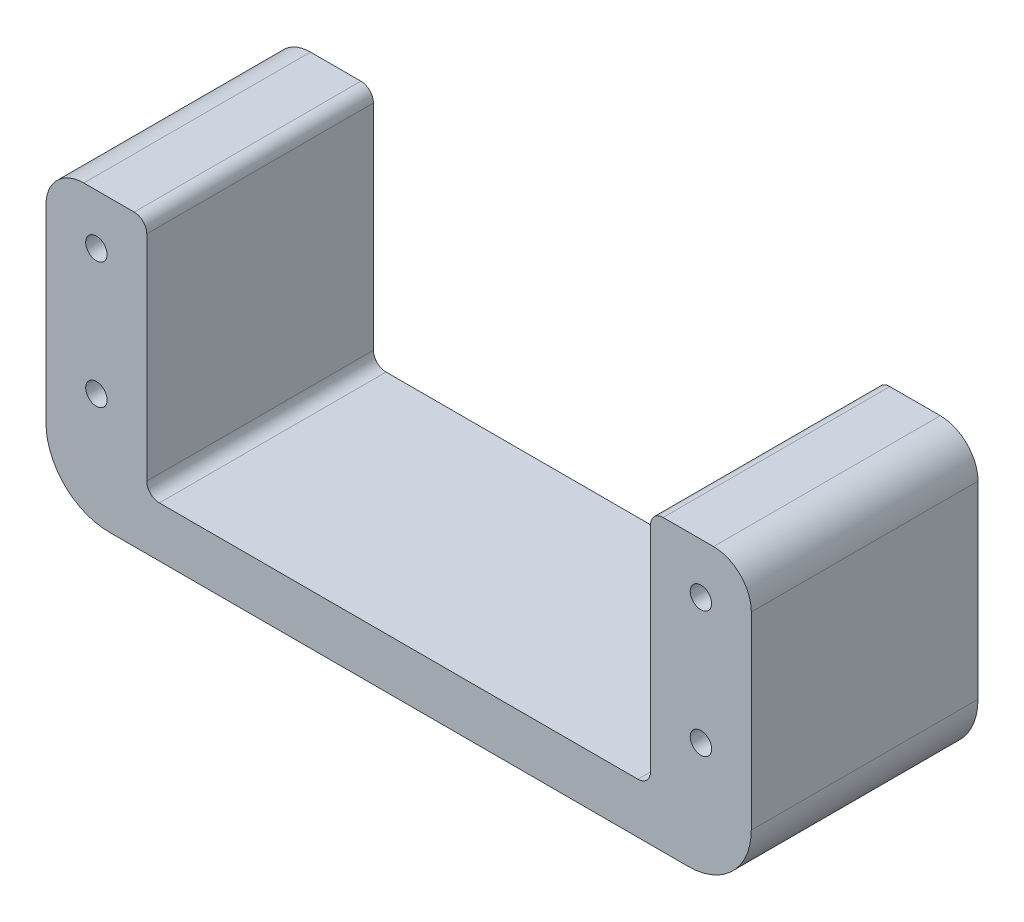
ISO-10303-21;
HEADER;
FILE_DESCRIPTION(('STEP AP214'),'2;1');
FILE_NAME('part.step','',(''),(''),'','','');
FILE_SCHEMA(('AUTOMOTIVE_DESIGN { 1 0 10303 214 1 1 1 1 }'));
ENDSEC;
DATA;
#1=APPLICATION_CONTEXT('core data for automotive mechanical design processes');
#2=APPLICATION_PROTOCOL_DEFINITION('international standard','automotive_design',2000,#1);
#3=PRODUCT_CONTEXT('',#1,'mechanical');
#4=PRODUCT('Part','Part','',(#3));
#5=PRODUCT_RELATED_PRODUCT_CATEGORY('part','',(#4));
#6=PRODUCT_DEFINITION_FORMATION('','',#4);
#7=PRODUCT_DEFINITION_CONTEXT('part definition',#1,'design');
#8=PRODUCT_DEFINITION('design','',#6,#7);
#9=PRODUCT_DEFINITION_SHAPE('','',#8);
#10=(LENGTH_UNIT() NAMED_UNIT(*) SI_UNIT(.MILLI.,.METRE.));
#11=(NAMED_UNIT(*) PLANE_ANGLE_UNIT() SI_UNIT($,.RADIAN.));
#12=(NAMED_UNIT(*) SI_UNIT($,.STERADIAN.) SOLID_ANGLE_UNIT());
#13=UNCERTAINTY_MEASURE_WITH_UNIT(LENGTH_MEASURE(1.E-05),#10,'distance_accuracy_value','');
#14=(GEOMETRIC_REPRESENTATION_CONTEXT(3) GLOBAL_UNCERTAINTY_ASSIGNED_CONTEXT((#13)) GLOBAL_UNIT_ASSIGNED_CONTEXT((#10,
#11,#12)) REPRESENTATION_CONTEXT('',''));
#15=CARTESIAN_POINT('',(0.,0.,0.));
#16=DIRECTION('',(0.,0.,1.));
#17=DIRECTION('',(1.,0.,0.));
#18=AXIS2_PLACEMENT_3D('',#15,#16,#17);
#19=CARTESIAN_POINT('',(0.,0.,18.));
#20=DIRECTION('',(0.,0.,1.));
#21=DIRECTION('',(1.,0.,0.));
#22=AXIS2_PLACEMENT_3D('',#19,#20,#21);
#23=PLANE('',#22);
#24=CARTESIAN_POINT('',(24.,9.,18.));
#25=DIRECTION('',(0.,0.,1.));
#26=DIRECTION('',(-1.,0.,0.));
#27=AXIS2_PLACEMENT_3D('',#24,#25,#26);
#28=CIRCLE('',#27,0.85);
#29=CARTESIAN_POINT('',(23.15,9.,18.));
#30=VERTEX_POINT('',#29);
#31=EDGE_CURVE('E297',#30,#30,#28,.T.);
#32=ORIENTED_EDGE('',*,*,#31,.F.);
#33=EDGE_LOOP('',(#32));
#34=FACE_BOUND('',#33,.T.);
#35=CARTESIAN_POINT('',(-24.,19.,18.));
#36=DIRECTION('',(0.,0.,1.));
#37=DIRECTION('',(1.,0.,0.));
#38=AXIS2_PLACEMENT_3D('',#35,#36,#37);
#39=CIRCLE('',#38,0.85);
#40=CARTESIAN_POINT('',(-23.15,19.,18.));
#41=VERTEX_POINT('',#40);
#42=EDGE_CURVE('E273',#41,#41,#39,.T.);
#43=ORIENTED_EDGE('',*,*,#42,.F.);
#44=EDGE_LOOP('',(#43));
#45=FACE_BOUND('',#44,.T.);
#46=DIRECTION('',(1.,0.,0.));
#47=VECTOR('',#46,1.);
#48=CARTESIAN_POINT('',(-28.,0.,18.));
#49=LINE('',#48,#47);
#50=CARTESIAN_POINT('',(-23.,0.,18.));
#51=VERTEX_POINT('',#50);
#52=CARTESIAN_POINT('',(23.,0.,18.));
#53=VERTEX_POINT('',#52);
#54=EDGE_CURVE('E257',#51,#53,#49,.T.);
#55=ORIENTED_EDGE('',*,*,#54,.T.);
#56=CARTESIAN_POINT('',(23.,5.,18.));
#57=DIRECTION('',(0.,0.,1.));
#58=DIRECTION('',(1.,0.,0.));
#59=AXIS2_PLACEMENT_3D('',#56,#57,#58);
#60=CIRCLE('',#59,5.);
#61=CARTESIAN_POINT('',(28.,5.,18.));
#62=VERTEX_POINT('',#61);
#63=EDGE_CURVE('E41',#53,#62,#60,.T.);
#64=ORIENTED_EDGE('',*,*,#63,.T.);
#65=DIRECTION('',(0.,1.,0.));
#66=VECTOR('',#65,1.);
#67=CARTESIAN_POINT('',(28.,23.,18.));
#68=LINE('',#67,#66);
#69=CARTESIAN_POINT('',(28.,20.,18.));
#70=VERTEX_POINT('',#69);
#71=EDGE_CURVE('E256',#62,#70,#68,.T.);
#72=ORIENTED_EDGE('',*,*,#71,.T.);
#73=CARTESIAN_POINT('',(25.,20.,18.));
#74=DIRECTION('',(0.,0.,1.));
#75=DIRECTION('',(1.,0.,0.));
#76=AXIS2_PLACEMENT_3D('',#73,#74,#75);
#77=CIRCLE('',#76,3.);
#78=CARTESIAN_POINT('',(25.,23.,18.));
#79=VERTEX_POINT('',#78);
#80=EDGE_CURVE('E233',#70,#79,#77,.T.);
#81=ORIENTED_EDGE('',*,*,#80,.T.);
#82=DIRECTION('',(-1.,0.,0.));
#83=VECTOR('',#82,1.);
#84=CARTESIAN_POINT('',(20.,23.,18.));
#85=LINE('',#84,#83);
#86=CARTESIAN_POINT('',(21.,23.,18.));
#87=VERTEX_POINT('',#86);
#88=EDGE_CURVE('E264',#79,#87,#85,.T.);
#89=ORIENTED_EDGE('',*,*,#88,.T.);
#90=CARTESIAN_POINT('',(21.,22.,18.));
#91=DIRECTION('',(0.,0.,1.));
#92=DIRECTION('',(1.,0.,0.));
#93=AXIS2_PLACEMENT_3D('',#90,#91,#92);
#94=CIRCLE('',#93,1.);
#95=CARTESIAN_POINT('',(20.,22.,18.));
#96=VERTEX_POINT('',#95);
#97=EDGE_CURVE('E198',#87,#96,#94,.T.);
#98=ORIENTED_EDGE('',*,*,#97,.T.);
#99=DIRECTION('',(0.,-1.,0.));
#100=VECTOR('',#99,1.);
#101=CARTESIAN_POINT('',(20.,23.,18.));
#102=LINE('',#101,#100);
#103=CARTESIAN_POINT('',(20.,5.,18.));
#104=VERTEX_POINT('',#103);
#105=EDGE_CURVE('E168',#96,#104,#102,.T.);
#106=ORIENTED_EDGE('',*,*,#105,.T.);
#107=CARTESIAN_POINT('',(19.,5.,18.));
#108=DIRECTION('',(0.,0.,1.));
#109=DIRECTION('',(1.,0.,0.));
#110=AXIS2_PLACEMENT_3D('',#107,#108,#109);
#111=CIRCLE('',#110,1.);
#112=CARTESIAN_POINT('',(19.,4.,18.));
#113=VERTEX_POINT('',#112);
#114=EDGE_CURVE('E214',#104,#113,#111,.F.);
#115=ORIENTED_EDGE('',*,*,#114,.T.);
#116=DIRECTION('',(-1.,0.,0.));
#117=VECTOR('',#116,1.);
#118=CARTESIAN_POINT('',(-20.,4.,18.));
#119=LINE('',#118,#117);
#120=CARTESIAN_POINT('',(-19.,4.,18.));
#121=VERTEX_POINT('',#120);
#122=EDGE_CURVE('E281',#113,#121,#119,.T.);
#123=ORIENTED_EDGE('',*,*,#122,.T.);
#124=CARTESIAN_POINT('',(-19.,5.,18.));
#125=DIRECTION('',(0.,0.,1.));
#126=DIRECTION('',(1.,0.,0.));
#127=AXIS2_PLACEMENT_3D('',#124,#125,#126);
#128=CIRCLE('',#127,1.);
#129=CARTESIAN_POINT('',(-20.,5.,18.));
#130=VERTEX_POINT('',#129);
#131=EDGE_CURVE('E218',#121,#130,#128,.F.);
#132=ORIENTED_EDGE('',*,*,#131,.T.);
#133=DIRECTION('',(0.,1.,0.));
#134=VECTOR('',#133,1.);
#135=CARTESIAN_POINT('',(-20.,23.,18.));
#136=LINE('',#135,#134);
#137=CARTESIAN_POINT('',(-20.,22.,18.));
#138=VERTEX_POINT('',#137);
#139=EDGE_CURVE('E278',#130,#138,#136,.T.);
#140=ORIENTED_EDGE('',*,*,#139,.T.);
#141=CARTESIAN_POINT('',(-21.,22.,18.));
#142=DIRECTION('',(0.,0.,1.));
#143=DIRECTION('',(1.,0.,0.));
#144=AXIS2_PLACEMENT_3D('',#141,#142,#143);
#145=CIRCLE('',#144,1.);
#146=CARTESIAN_POINT('',(-21.,23.,18.));
#147=VERTEX_POINT('',#146);
#148=EDGE_CURVE('E196',#138,#147,#145,.T.);
#149=ORIENTED_EDGE('',*,*,#148,.T.);
#150=DIRECTION('',(-1.,0.,0.));
#151=VECTOR('',#150,1.);
#152=CARTESIAN_POINT('',(-28.,23.,18.));
#153=LINE('',#152,#151);
#154=CARTESIAN_POINT('',(-25.,23.,18.));
#155=VERTEX_POINT('',#154);
#156=EDGE_CURVE('E192',#147,#155,#153,.T.);
#157=ORIENTED_EDGE('',*,*,#156,.T.);
#158=CARTESIAN_POINT('',(-25.,20.,18.));
#159=DIRECTION('',(0.,0.,1.));
#160=DIRECTION('',(1.,0.,0.));
#161=AXIS2_PLACEMENT_3D('',#158,#159,#160);
#162=CIRCLE('',#161,3.);
#163=CARTESIAN_POINT('',(-28.,20.,18.));
#164=VERTEX_POINT('',#163);
#165=EDGE_CURVE('E231',#155,#164,#162,.T.);
#166=ORIENTED_EDGE('',*,*,#165,.T.);
#167=DIRECTION('',(0.,-1.,0.));
#168=VECTOR('',#167,1.);
#169=CARTESIAN_POINT('',(-28.,23.,18.));
#170=LINE('',#169,#168);
#171=CARTESIAN_POINT('',(-28.,5.,18.));
#172=VERTEX_POINT('',#171);
#173=EDGE_CURVE('E191',#164,#172,#170,.T.);
#174=ORIENTED_EDGE('',*,*,#173,.T.);
#175=CARTESIAN_POINT('',(-23.,5.,18.));
#176=DIRECTION('',(0.,0.,1.));
#177=DIRECTION('',(1.,0.,0.));
#178=AXIS2_PLACEMENT_3D('',#175,#176,#177);
#179=CIRCLE('',#178,5.);
#180=EDGE_CURVE('E251',#172,#51,#179,.T.);
#181=ORIENTED_EDGE('',*,*,#180,.T.);
#182=EDGE_LOOP('',(#55,#64,#72,#81,#89,#98,#106,#115,#123,#132,#140,#149,#157,#166,#174,#181));
#183=FACE_BOUND('',#182,.T.);
#184=CARTESIAN_POINT('',(-24.,9.,18.));
#185=DIRECTION('',(0.,0.,1.));
#186=DIRECTION('',(1.,0.,0.));
#187=AXIS2_PLACEMENT_3D('',#184,#185,#186);
#188=CIRCLE('',#187,0.85);
#189=CARTESIAN_POINT('',(-23.15,9.,18.));
#190=VERTEX_POINT('',#189);
#191=EDGE_CURVE('E291',#190,#190,#188,.T.);
#192=ORIENTED_EDGE('',*,*,#191,.F.);
#193=EDGE_LOOP('',(#192));
#194=FACE_BOUND('',#193,.T.);
#195=CARTESIAN_POINT('',(24.,19.,18.));
#196=DIRECTION('',(0.,0.,1.));
#197=DIRECTION('',(-1.,0.,0.));
#198=AXIS2_PLACEMENT_3D('',#195,#196,#197);
#199=CIRCLE('',#198,0.85);
#200=CARTESIAN_POINT('',(23.15,19.,18.));
#201=VERTEX_POINT('',#200);
#202=EDGE_CURVE('E303',#201,#201,#199,.T.);
#203=ORIENTED_EDGE('',*,*,#202,.F.);
#204=EDGE_LOOP('',(#203));
#205=FACE_BOUND('',#204,.T.);
#206=ADVANCED_FACE('F33',(#34,#45,#183,#194,#205),#23,.T.);
#207=CARTESIAN_POINT('',(0.,0.,0.));
#208=DIRECTION('',(0.,0.,1.));
#209=DIRECTION('',(1.,0.,0.));
#210=AXIS2_PLACEMENT_3D('',#207,#208,#209);
#211=PLANE('',#210);
#212=DIRECTION('',(0.,1.,0.));
#213=VECTOR('',#212,1.);
#214=CARTESIAN_POINT('',(28.,23.,0.));
#215=LINE('',#214,#213);
#216=CARTESIAN_POINT('',(28.,5.,0.));
#217=VERTEX_POINT('',#216);
#218=CARTESIAN_POINT('',(28.,20.,0.));
#219=VERTEX_POINT('',#218);
#220=EDGE_CURVE('E182',#217,#219,#215,.T.);
#221=ORIENTED_EDGE('',*,*,#220,.F.);
#222=CARTESIAN_POINT('',(23.,5.,0.));
#223=DIRECTION('',(0.,0.,1.));
#224=DIRECTION('',(1.,0.,0.));
#225=AXIS2_PLACEMENT_3D('',#222,#223,#224);
#226=CIRCLE('',#225,5.);
#227=CARTESIAN_POINT('',(23.,0.,0.));
#228=VERTEX_POINT('',#227);
#229=EDGE_CURVE('E245',#217,#228,#226,.F.);
#230=ORIENTED_EDGE('',*,*,#229,.T.);
#231=DIRECTION('',(1.,0.,0.));
#232=VECTOR('',#231,1.);
#233=CARTESIAN_POINT('',(-28.,0.,0.));
#234=LINE('',#233,#232);
#235=CARTESIAN_POINT('',(-23.,0.,0.));
#236=VERTEX_POINT('',#235);
#237=EDGE_CURVE('E268',#236,#228,#234,.T.);
#238=ORIENTED_EDGE('',*,*,#237,.F.);
#239=CARTESIAN_POINT('',(-23.,5.,0.));
#240=DIRECTION('',(0.,0.,1.));
#241=DIRECTION('',(1.,0.,0.));
#242=AXIS2_PLACEMENT_3D('',#239,#240,#241);
#243=CIRCLE('',#242,5.);
#244=CARTESIAN_POINT('',(-28.,5.,0.));
#245=VERTEX_POINT('',#244);
#246=EDGE_CURVE('E243',#236,#245,#243,.F.);
#247=ORIENTED_EDGE('',*,*,#246,.T.);
#248=DIRECTION('',(0.,-1.,0.));
#249=VECTOR('',#248,1.);
#250=CARTESIAN_POINT('',(-28.,23.,0.));
#251=LINE('',#250,#249);
#252=CARTESIAN_POINT('',(-28.,20.,0.));
#253=VERTEX_POINT('',#252);
#254=EDGE_CURVE('E271',#253,#245,#251,.T.);
#255=ORIENTED_EDGE('',*,*,#254,.F.);
#256=CARTESIAN_POINT('',(-25.,20.,0.));
#257=DIRECTION('',(0.,0.,1.));
#258=DIRECTION('',(1.,0.,0.));
#259=AXIS2_PLACEMENT_3D('',#256,#257,#258);
#260=CIRCLE('',#259,3.);
#261=CARTESIAN_POINT('',(-25.,23.,0.));
#262=VERTEX_POINT('',#261);
#263=EDGE_CURVE('E223',#253,#262,#260,.F.);
#264=ORIENTED_EDGE('',*,*,#263,.T.);
#265=DIRECTION('',(-1.,0.,0.));
#266=VECTOR('',#265,1.);
#267=CARTESIAN_POINT('',(-28.,23.,0.));
#268=LINE('',#267,#266);
#269=CARTESIAN_POINT('',(-21.,23.,0.));
#270=VERTEX_POINT('',#269);
#271=EDGE_CURVE('E188',#270,#262,#268,.T.);
#272=ORIENTED_EDGE('',*,*,#271,.F.);
#273=CARTESIAN_POINT('',(-21.,22.,0.));
#274=DIRECTION('',(0.,0.,1.));
#275=DIRECTION('',(1.,0.,0.));
#276=AXIS2_PLACEMENT_3D('',#273,#274,#275);
#277=CIRCLE('',#276,1.);
#278=CARTESIAN_POINT('',(-20.,22.,0.));
#279=VERTEX_POINT('',#278);
#280=EDGE_CURVE('E159',#270,#279,#277,.F.);
#281=ORIENTED_EDGE('',*,*,#280,.T.);
#282=DIRECTION('',(0.,1.,0.));
#283=VECTOR('',#282,1.);
#284=CARTESIAN_POINT('',(-20.,23.,0.));
#285=LINE('',#284,#283);
#286=CARTESIAN_POINT('',(-20.,5.,0.));
#287=VERTEX_POINT('',#286);
#288=EDGE_CURVE('E180',#287,#279,#285,.T.);
#289=ORIENTED_EDGE('',*,*,#288,.F.);
#290=CARTESIAN_POINT('',(-19.,5.,0.));
#291=DIRECTION('',(0.,0.,1.));
#292=DIRECTION('',(1.,0.,0.));
#293=AXIS2_PLACEMENT_3D('',#290,#291,#292);
#294=CIRCLE('',#293,1.);
#295=CARTESIAN_POINT('',(-19.,4.,0.));
#296=VERTEX_POINT('',#295);
#297=EDGE_CURVE('E216',#287,#296,#294,.T.);
#298=ORIENTED_EDGE('',*,*,#297,.T.);
#299=DIRECTION('',(-1.,0.,0.));
#300=VECTOR('',#299,1.);
#301=CARTESIAN_POINT('',(-20.,4.,0.));
#302=LINE('',#301,#300);
#303=CARTESIAN_POINT('',(19.,4.,0.));
#304=VERTEX_POINT('',#303);
#305=EDGE_CURVE('E176',#304,#296,#302,.T.);
#306=ORIENTED_EDGE('',*,*,#305,.F.);
#307=CARTESIAN_POINT('',(19.,5.,0.));
#308=DIRECTION('',(0.,0.,1.));
#309=DIRECTION('',(1.,0.,0.));
#310=AXIS2_PLACEMENT_3D('',#307,#308,#309);
#311=CIRCLE('',#310,1.);
#312=CARTESIAN_POINT('',(20.,5.,0.));
#313=VERTEX_POINT('',#312);
#314=EDGE_CURVE('E175',#304,#313,#311,.T.);
#315=ORIENTED_EDGE('',*,*,#314,.T.);
#316=DIRECTION('',(0.,-1.,0.));
#317=VECTOR('',#316,1.);
#318=CARTESIAN_POINT('',(20.,23.,0.));
#319=LINE('',#318,#317);
#320=CARTESIAN_POINT('',(20.,22.,0.));
#321=VERTEX_POINT('',#320);
#322=EDGE_CURVE('E165',#321,#313,#319,.T.);
#323=ORIENTED_EDGE('',*,*,#322,.F.);
#324=CARTESIAN_POINT('',(21.,22.,0.));
#325=DIRECTION('',(0.,0.,1.));
#326=DIRECTION('',(1.,0.,0.));
#327=AXIS2_PLACEMENT_3D('',#324,#325,#326);
#328=CIRCLE('',#327,1.);
#329=CARTESIAN_POINT('',(21.,23.,0.));
#330=VERTEX_POINT('',#329);
#331=EDGE_CURVE('E149',#321,#330,#328,.F.);
#332=ORIENTED_EDGE('',*,*,#331,.T.);
#333=DIRECTION('',(-1.,0.,0.));
#334=VECTOR('',#333,1.);
#335=CARTESIAN_POINT('',(20.,23.,0.));
#336=LINE('',#335,#334);
#337=CARTESIAN_POINT('',(25.,23.,0.));
#338=VERTEX_POINT('',#337);
#339=EDGE_CURVE('E177',#338,#330,#336,.T.);
#340=ORIENTED_EDGE('',*,*,#339,.F.);
#341=CARTESIAN_POINT('',(25.,20.,0.));
#342=DIRECTION('',(0.,0.,1.));
#343=DIRECTION('',(1.,0.,0.));
#344=AXIS2_PLACEMENT_3D('',#341,#342,#343);
#345=CIRCLE('',#344,3.);
#346=EDGE_CURVE('E225',#338,#219,#345,.F.);
#347=ORIENTED_EDGE('',*,*,#346,.T.);
#348=EDGE_LOOP('',(#221,#230,#238,#247,#255,#264,#272,#281,#289,#298,#306,#315,#323,#332,#340,#347));
#349=FACE_BOUND('',#348,.T.);
#350=CARTESIAN_POINT('',(-24.,19.,0.));
#351=DIRECTION('',(0.,0.,1.));
#352=DIRECTION('',(1.,0.,0.));
#353=AXIS2_PLACEMENT_3D('',#350,#351,#352);
#354=CIRCLE('',#353,0.85);
#355=CARTESIAN_POINT('',(-23.15,19.,0.));
#356=VERTEX_POINT('',#355);
#357=EDGE_CURVE('E288',#356,#356,#354,.T.);
#358=ORIENTED_EDGE('',*,*,#357,.T.);
#359=EDGE_LOOP('',(#358));
#360=FACE_BOUND('',#359,.T.);
#361=CARTESIAN_POINT('',(-24.,9.,0.));
#362=DIRECTION('',(0.,0.,1.));
#363=DIRECTION('',(1.,0.,0.));
#364=AXIS2_PLACEMENT_3D('',#361,#362,#363);
#365=CIRCLE('',#364,0.85);
#366=CARTESIAN_POINT('',(-23.15,9.,0.));
#367=VERTEX_POINT('',#366);
#368=EDGE_CURVE('E294',#367,#367,#365,.T.);
#369=ORIENTED_EDGE('',*,*,#368,.T.);
#370=EDGE_LOOP('',(#369));
#371=FACE_BOUND('',#370,.T.);
#372=CARTESIAN_POINT('',(24.,9.,0.));
#373=DIRECTION('',(0.,0.,1.));
#374=DIRECTION('',(-1.,0.,0.));
#375=AXIS2_PLACEMENT_3D('',#372,#373,#374);
#376=CIRCLE('',#375,0.85);
#377=CARTESIAN_POINT('',(23.15,9.,0.));
#378=VERTEX_POINT('',#377);
#379=EDGE_CURVE('E300',#378,#378,#376,.T.);
#380=ORIENTED_EDGE('',*,*,#379,.T.);
#381=EDGE_LOOP('',(#380));
#382=FACE_BOUND('',#381,.T.);
#383=CARTESIAN_POINT('',(24.,19.,0.));
#384=DIRECTION('',(0.,0.,1.));
#385=DIRECTION('',(-1.,0.,0.));
#386=AXIS2_PLACEMENT_3D('',#383,#384,#385);
#387=CIRCLE('',#386,0.85);
#388=CARTESIAN_POINT('',(23.15,19.,0.));
#389=VERTEX_POINT('',#388);
#390=EDGE_CURVE('E306',#389,#389,#387,.T.);
#391=ORIENTED_EDGE('',*,*,#390,.T.);
#392=EDGE_LOOP('',(#391));
#393=FACE_BOUND('',#392,.T.);
#394=ADVANCED_FACE('F172',(#349,#360,#371,#382,#393),#211,.F.);
#395=CARTESIAN_POINT('',(-28.,23.,18.));
#396=DIRECTION('',(1.,0.,0.));
#397=DIRECTION('',(0.,1.,0.));
#398=AXIS2_PLACEMENT_3D('',#395,#396,#397);
#399=PLANE('',#398);
#400=ORIENTED_EDGE('',*,*,#254,.T.);
#401=DIRECTION('',(0.,0.,-1.));
#402=VECTOR('',#401,1.);
#403=CARTESIAN_POINT('',(-28.,5.,18.));
#404=LINE('',#403,#402);
#405=EDGE_CURVE('E11',#245,#172,#404,.F.);
#406=ORIENTED_EDGE('',*,*,#405,.T.);
#407=ORIENTED_EDGE('',*,*,#173,.F.);
#408=DIRECTION('',(0.,0.,-1.));
#409=VECTOR('',#408,1.);
#410=CARTESIAN_POINT('',(-28.,20.,18.));
#411=LINE('',#410,#409);
#412=EDGE_CURVE('E235',#164,#253,#411,.T.);
#413=ORIENTED_EDGE('',*,*,#412,.T.);
#414=EDGE_LOOP('',(#400,#406,#407,#413));
#415=FACE_BOUND('',#414,.T.);
#416=ADVANCED_FACE('F321',(#415),#399,.F.);
#417=CARTESIAN_POINT('',(-28.,0.,18.));
#418=DIRECTION('',(0.,1.,0.));
#419=DIRECTION('',(0.,0.,1.));
#420=AXIS2_PLACEMENT_3D('',#417,#418,#419);
#421=PLANE('',#420);
#422=ORIENTED_EDGE('',*,*,#237,.T.);
#423=DIRECTION('',(0.,0.,-1.));
#424=VECTOR('',#423,1.);
#425=CARTESIAN_POINT('',(23.,0.,18.));
#426=LINE('',#425,#424);
#427=EDGE_CURVE('E54',#228,#53,#426,.F.);
#428=ORIENTED_EDGE('',*,*,#427,.T.);
#429=ORIENTED_EDGE('',*,*,#54,.F.);
#430=DIRECTION('',(0.,0.,-1.));
#431=VECTOR('',#430,1.);
#432=CARTESIAN_POINT('',(-23.,0.,18.));
#433=LINE('',#432,#431);
#434=EDGE_CURVE('E247',#51,#236,#433,.T.);
#435=ORIENTED_EDGE('',*,*,#434,.T.);
#436=EDGE_LOOP('',(#422,#428,#429,#435));
#437=FACE_BOUND('',#436,.T.);
#438=ADVANCED_FACE('F269',(#437),#421,.F.);
#439=CARTESIAN_POINT('',(28.,23.,18.));
#440=DIRECTION('',(-1.,0.,0.));
#441=DIRECTION('',(0.,-1.,0.));
#442=AXIS2_PLACEMENT_3D('',#439,#440,#441);
#443=PLANE('',#442);
#444=ORIENTED_EDGE('',*,*,#71,.F.);
#445=DIRECTION('',(0.,0.,-1.));
#446=VECTOR('',#445,1.);
#447=CARTESIAN_POINT('',(28.,5.,18.));
#448=LINE('',#447,#446);
#449=EDGE_CURVE('E240',#62,#217,#448,.T.);
#450=ORIENTED_EDGE('',*,*,#449,.T.);
#451=ORIENTED_EDGE('',*,*,#220,.T.);
#452=DIRECTION('',(0.,0.,-1.));
#453=VECTOR('',#452,1.);
#454=CARTESIAN_POINT('',(28.,20.,18.));
#455=LINE('',#454,#453);
#456=EDGE_CURVE('E228',#219,#70,#455,.F.);
#457=ORIENTED_EDGE('',*,*,#456,.T.);
#458=EDGE_LOOP('',(#444,#450,#451,#457));
#459=FACE_BOUND('',#458,.T.);
#460=ADVANCED_FACE('F261',(#459),#443,.F.);
#461=CARTESIAN_POINT('',(20.,23.,18.));
#462=DIRECTION('',(0.,-1.,0.));
#463=DIRECTION('',(0.,0.,-1.));
#464=AXIS2_PLACEMENT_3D('',#461,#462,#463);
#465=PLANE('',#464);
#466=ORIENTED_EDGE('',*,*,#88,.F.);
#467=DIRECTION('',(0.,0.,-1.));
#468=VECTOR('',#467,1.);
#469=CARTESIAN_POINT('',(25.,23.,18.));
#470=LINE('',#469,#468);
#471=EDGE_CURVE('E220',#79,#338,#470,.T.);
#472=ORIENTED_EDGE('',*,*,#471,.T.);
#473=ORIENTED_EDGE('',*,*,#339,.T.);
#474=DIRECTION('',(0.,0.,-1.));
#475=VECTOR('',#474,1.);
#476=CARTESIAN_POINT('',(21.,23.,18.));
#477=LINE('',#476,#475);
#478=EDGE_CURVE('E155',#330,#87,#477,.F.);
#479=ORIENTED_EDGE('',*,*,#478,.T.);
#480=EDGE_LOOP('',(#466,#472,#473,#479));
#481=FACE_BOUND('',#480,.T.);
#482=ADVANCED_FACE('F343',(#481),#465,.F.);
#483=CARTESIAN_POINT('',(20.,23.,18.));
#484=DIRECTION('',(1.,0.,0.));
#485=DIRECTION('',(0.,1.,0.));
#486=AXIS2_PLACEMENT_3D('',#483,#484,#485);
#487=PLANE('',#486);
#488=ORIENTED_EDGE('',*,*,#105,.F.);
#489=DIRECTION('',(0.,0.,-1.));
#490=VECTOR('',#489,1.);
#491=CARTESIAN_POINT('',(20.,22.,18.));
#492=LINE('',#491,#490);
#493=EDGE_CURVE('E153',#96,#321,#492,.T.);
#494=ORIENTED_EDGE('',*,*,#493,.T.);
#495=ORIENTED_EDGE('',*,*,#322,.T.);
#496=DIRECTION('',(0.,0.,-1.));
#497=VECTOR('',#496,1.);
#498=CARTESIAN_POINT('',(20.,5.,18.));
#499=LINE('',#498,#497);
#500=EDGE_CURVE('E169',#313,#104,#499,.F.);
#501=ORIENTED_EDGE('',*,*,#500,.T.);
#502=EDGE_LOOP('',(#488,#494,#495,#501));
#503=FACE_BOUND('',#502,.T.);
#504=ADVANCED_FACE('F164',(#503),#487,.F.);
#505=CARTESIAN_POINT('',(-20.,4.,18.));
#506=DIRECTION('',(0.,-1.,0.));
#507=DIRECTION('',(0.,0.,-1.));
#508=AXIS2_PLACEMENT_3D('',#505,#506,#507);
#509=PLANE('',#508);
#510=ORIENTED_EDGE('',*,*,#122,.F.);
#511=DIRECTION('',(0.,0.,-1.));
#512=VECTOR('',#511,1.);
#513=CARTESIAN_POINT('',(19.,4.,0.));
#514=LINE('',#513,#512);
#515=EDGE_CURVE('E210',#113,#304,#514,.T.);
#516=ORIENTED_EDGE('',*,*,#515,.T.);
#517=ORIENTED_EDGE('',*,*,#305,.T.);
#518=DIRECTION('',(0.,0.,-1.));
#519=VECTOR('',#518,1.);
#520=CARTESIAN_POINT('',(-19.,4.,18.));
#521=LINE('',#520,#519);
#522=EDGE_CURVE('E208',#296,#121,#521,.F.);
#523=ORIENTED_EDGE('',*,*,#522,.T.);
#524=EDGE_LOOP('',(#510,#516,#517,#523));
#525=FACE_BOUND('',#524,.T.);
#526=ADVANCED_FACE('F336',(#525),#509,.F.);
#527=CARTESIAN_POINT('',(-20.,23.,18.));
#528=DIRECTION('',(-1.,0.,0.));
#529=DIRECTION('',(0.,-1.,0.));
#530=AXIS2_PLACEMENT_3D('',#527,#528,#529);
#531=PLANE('',#530);
#532=ORIENTED_EDGE('',*,*,#288,.T.);
#533=DIRECTION('',(0.,0.,-1.));
#534=VECTOR('',#533,1.);
#535=CARTESIAN_POINT('',(-20.,22.,18.));
#536=LINE('',#535,#534);
#537=EDGE_CURVE('E206',#279,#138,#536,.F.);
#538=ORIENTED_EDGE('',*,*,#537,.T.);
#539=ORIENTED_EDGE('',*,*,#139,.F.);
#540=DIRECTION('',(0.,0.,-1.));
#541=VECTOR('',#540,1.);
#542=CARTESIAN_POINT('',(-20.,5.,0.));
#543=LINE('',#542,#541);
#544=EDGE_CURVE('E203',#130,#287,#543,.T.);
#545=ORIENTED_EDGE('',*,*,#544,.T.);
#546=EDGE_LOOP('',(#532,#538,#539,#545));
#547=FACE_BOUND('',#546,.T.);
#548=ADVANCED_FACE('F332',(#547),#531,.F.);
#549=CARTESIAN_POINT('',(-28.,23.,18.));
#550=DIRECTION('',(0.,-1.,0.));
#551=DIRECTION('',(0.,0.,-1.));
#552=AXIS2_PLACEMENT_3D('',#549,#550,#551);
#553=PLANE('',#552);
#554=ORIENTED_EDGE('',*,*,#271,.T.);
#555=DIRECTION('',(0.,0.,-1.));
#556=VECTOR('',#555,1.);
#557=CARTESIAN_POINT('',(-25.,23.,18.));
#558=LINE('',#557,#556);
#559=EDGE_CURVE('E238',#262,#155,#558,.F.);
#560=ORIENTED_EDGE('',*,*,#559,.T.);
#561=ORIENTED_EDGE('',*,*,#156,.F.);
#562=DIRECTION('',(0.,0.,-1.));
#563=VECTOR('',#562,1.);
#564=CARTESIAN_POINT('',(-21.,23.,18.));
#565=LINE('',#564,#563);
#566=EDGE_CURVE('E200',#147,#270,#565,.T.);
#567=ORIENTED_EDGE('',*,*,#566,.T.);
#568=EDGE_LOOP('',(#554,#560,#561,#567));
#569=FACE_BOUND('',#568,.T.);
#570=ADVANCED_FACE('F329',(#569),#553,.F.);
#571=CARTESIAN_POINT('',(-24.,19.,18.));
#572=DIRECTION('',(0.,0.,-1.));
#573=DIRECTION('',(-1.,0.,0.));
#574=AXIS2_PLACEMENT_3D('',#571,#572,#573);
#575=CYLINDRICAL_SURFACE('',#574,0.85);
#576=ORIENTED_EDGE('',*,*,#42,.T.);
#577=EDGE_LOOP('',(#576));
#578=FACE_BOUND('',#577,.T.);
#579=ORIENTED_EDGE('',*,*,#357,.F.);
#580=EDGE_LOOP('',(#579));
#581=FACE_BOUND('',#580,.T.);
#582=ADVANCED_FACE('F326',(#578,#581),#575,.F.);
#583=CARTESIAN_POINT('',(-24.,9.,18.));
#584=DIRECTION('',(0.,0.,-1.));
#585=DIRECTION('',(-1.,0.,0.));
#586=AXIS2_PLACEMENT_3D('',#583,#584,#585);
#587=CYLINDRICAL_SURFACE('',#586,0.85);
#588=ORIENTED_EDGE('',*,*,#191,.T.);
#589=EDGE_LOOP('',(#588));
#590=FACE_BOUND('',#589,.T.);
#591=ORIENTED_EDGE('',*,*,#368,.F.);
#592=EDGE_LOOP('',(#591));
#593=FACE_BOUND('',#592,.T.);
#594=ADVANCED_FACE('F519',(#590,#593),#587,.F.);
#595=CARTESIAN_POINT('',(24.,9.,18.));
#596=DIRECTION('',(0.,0.,-1.));
#597=DIRECTION('',(-1.,0.,0.));
#598=AXIS2_PLACEMENT_3D('',#595,#596,#597);
#599=CYLINDRICAL_SURFACE('',#598,0.85);
#600=ORIENTED_EDGE('',*,*,#31,.T.);
#601=EDGE_LOOP('',(#600));
#602=FACE_BOUND('',#601,.T.);
#603=ORIENTED_EDGE('',*,*,#379,.F.);
#604=EDGE_LOOP('',(#603));
#605=FACE_BOUND('',#604,.T.);
#606=ADVANCED_FACE('F510',(#602,#605),#599,.F.);
#607=CARTESIAN_POINT('',(24.,19.,18.));
#608=DIRECTION('',(0.,0.,-1.));
#609=DIRECTION('',(-1.,0.,0.));
#610=AXIS2_PLACEMENT_3D('',#607,#608,#609);
#611=CYLINDRICAL_SURFACE('',#610,0.85);
#612=ORIENTED_EDGE('',*,*,#202,.T.);
#613=EDGE_LOOP('',(#612));
#614=FACE_BOUND('',#613,.T.);
#615=ORIENTED_EDGE('',*,*,#390,.F.);
#616=EDGE_LOOP('',(#615));
#617=FACE_BOUND('',#616,.T.);
#618=ADVANCED_FACE('F312',(#614,#617),#611,.F.);
#619=CARTESIAN_POINT('',(21.,22.,18.));
#620=DIRECTION('',(0.,0.,-1.));
#621=DIRECTION('',(-1.,0.,0.));
#622=AXIS2_PLACEMENT_3D('',#619,#620,#621);
#623=CYLINDRICAL_SURFACE('',#622,1.);
#624=ORIENTED_EDGE('',*,*,#97,.F.);
#625=ORIENTED_EDGE('',*,*,#478,.F.);
#626=ORIENTED_EDGE('',*,*,#331,.F.);
#627=ORIENTED_EDGE('',*,*,#493,.F.);
#628=EDGE_LOOP('',(#624,#625,#626,#627));
#629=FACE_BOUND('',#628,.T.);
#630=ADVANCED_FACE('F152',(#629),#623,.T.);
#631=CARTESIAN_POINT('',(-21.,22.,18.));
#632=DIRECTION('',(0.,0.,-1.));
#633=DIRECTION('',(-1.,0.,0.));
#634=AXIS2_PLACEMENT_3D('',#631,#632,#633);
#635=CYLINDRICAL_SURFACE('',#634,1.);
#636=ORIENTED_EDGE('',*,*,#148,.F.);
#637=ORIENTED_EDGE('',*,*,#537,.F.);
#638=ORIENTED_EDGE('',*,*,#280,.F.);
#639=ORIENTED_EDGE('',*,*,#566,.F.);
#640=EDGE_LOOP('',(#636,#637,#638,#639));
#641=FACE_BOUND('',#640,.T.);
#642=ADVANCED_FACE('F355',(#641),#635,.T.);
#643=CARTESIAN_POINT('',(19.,5.,18.));
#644=DIRECTION('',(0.,0.,1.));
#645=DIRECTION('',(1.,0.,0.));
#646=AXIS2_PLACEMENT_3D('',#643,#644,#645);
#647=CYLINDRICAL_SURFACE('',#646,1.);
#648=ORIENTED_EDGE('',*,*,#114,.F.);
#649=ORIENTED_EDGE('',*,*,#500,.F.);
#650=ORIENTED_EDGE('',*,*,#314,.F.);
#651=ORIENTED_EDGE('',*,*,#515,.F.);
#652=EDGE_LOOP('',(#648,#649,#650,#651));
#653=FACE_BOUND('',#652,.T.);
#654=ADVANCED_FACE('F358',(#653),#647,.F.);
#655=CARTESIAN_POINT('',(-19.,5.,18.));
#656=DIRECTION('',(0.,0.,1.));
#657=DIRECTION('',(1.,0.,0.));
#658=AXIS2_PLACEMENT_3D('',#655,#656,#657);
#659=CYLINDRICAL_SURFACE('',#658,1.);
#660=ORIENTED_EDGE('',*,*,#131,.F.);
#661=ORIENTED_EDGE('',*,*,#522,.F.);
#662=ORIENTED_EDGE('',*,*,#297,.F.);
#663=ORIENTED_EDGE('',*,*,#544,.F.);
#664=EDGE_LOOP('',(#660,#661,#662,#663));
#665=FACE_BOUND('',#664,.T.);
#666=ADVANCED_FACE('F362',(#665),#659,.F.);
#667=CARTESIAN_POINT('',(25.,20.,18.));
#668=DIRECTION('',(0.,0.,-1.));
#669=DIRECTION('',(-1.,0.,0.));
#670=AXIS2_PLACEMENT_3D('',#667,#668,#669);
#671=CYLINDRICAL_SURFACE('',#670,3.);
#672=ORIENTED_EDGE('',*,*,#80,.F.);
#673=ORIENTED_EDGE('',*,*,#456,.F.);
#674=ORIENTED_EDGE('',*,*,#346,.F.);
#675=ORIENTED_EDGE('',*,*,#471,.F.);
#676=EDGE_LOOP('',(#672,#673,#674,#675));
#677=FACE_BOUND('',#676,.T.);
#678=ADVANCED_FACE('F366',(#677),#671,.T.);
#679=CARTESIAN_POINT('',(-25.,20.,18.));
#680=DIRECTION('',(0.,0.,-1.));
#681=DIRECTION('',(-1.,0.,0.));
#682=AXIS2_PLACEMENT_3D('',#679,#680,#681);
#683=CYLINDRICAL_SURFACE('',#682,3.);
#684=ORIENTED_EDGE('',*,*,#165,.F.);
#685=ORIENTED_EDGE('',*,*,#559,.F.);
#686=ORIENTED_EDGE('',*,*,#263,.F.);
#687=ORIENTED_EDGE('',*,*,#412,.F.);
#688=EDGE_LOOP('',(#684,#685,#686,#687));
#689=FACE_BOUND('',#688,.T.);
#690=ADVANCED_FACE('F370',(#689),#683,.T.);
#691=CARTESIAN_POINT('',(23.,5.,18.));
#692=DIRECTION('',(0.,0.,-1.));
#693=DIRECTION('',(-1.,0.,0.));
#694=AXIS2_PLACEMENT_3D('',#691,#692,#693);
#695=CYLINDRICAL_SURFACE('',#694,5.);
#696=ORIENTED_EDGE('',*,*,#63,.F.);
#697=ORIENTED_EDGE('',*,*,#427,.F.);
#698=ORIENTED_EDGE('',*,*,#229,.F.);
#699=ORIENTED_EDGE('',*,*,#449,.F.);
#700=EDGE_LOOP('',(#696,#697,#698,#699));
#701=FACE_BOUND('',#700,.T.);
#702=ADVANCED_FACE('F266',(#701),#695,.T.);
#703=CARTESIAN_POINT('',(-23.,5.,18.));
#704=DIRECTION('',(0.,0.,-1.));
#705=DIRECTION('',(-1.,0.,0.));
#706=AXIS2_PLACEMENT_3D('',#703,#704,#705);
#707=CYLINDRICAL_SURFACE('',#706,5.);
#708=ORIENTED_EDGE('',*,*,#180,.F.);
#709=ORIENTED_EDGE('',*,*,#405,.F.);
#710=ORIENTED_EDGE('',*,*,#246,.F.);
#711=ORIENTED_EDGE('',*,*,#434,.F.);
#712=EDGE_LOOP('',(#708,#709,#710,#711));
#713=FACE_BOUND('',#712,.T.);
#714=ADVANCED_FACE('F35',(#713),#707,.T.);
#715=CLOSED_SHELL('',(#206,#394,#416,#438,#460,#482,#504,#526,#548,#570,#582,#594,#606,#618,
#630,#642,#654,#666,#678,#690,#702,#714));
#716=MANIFOLD_SOLID_BREP('B2',#715);
#717=ADVANCED_BREP_SHAPE_REPRESENTATION('',(#18,#716),#14);
#718=SHAPE_DEFINITION_REPRESENTATION(#9,#717);
ENDSEC;
END-ISO-10303-21;
